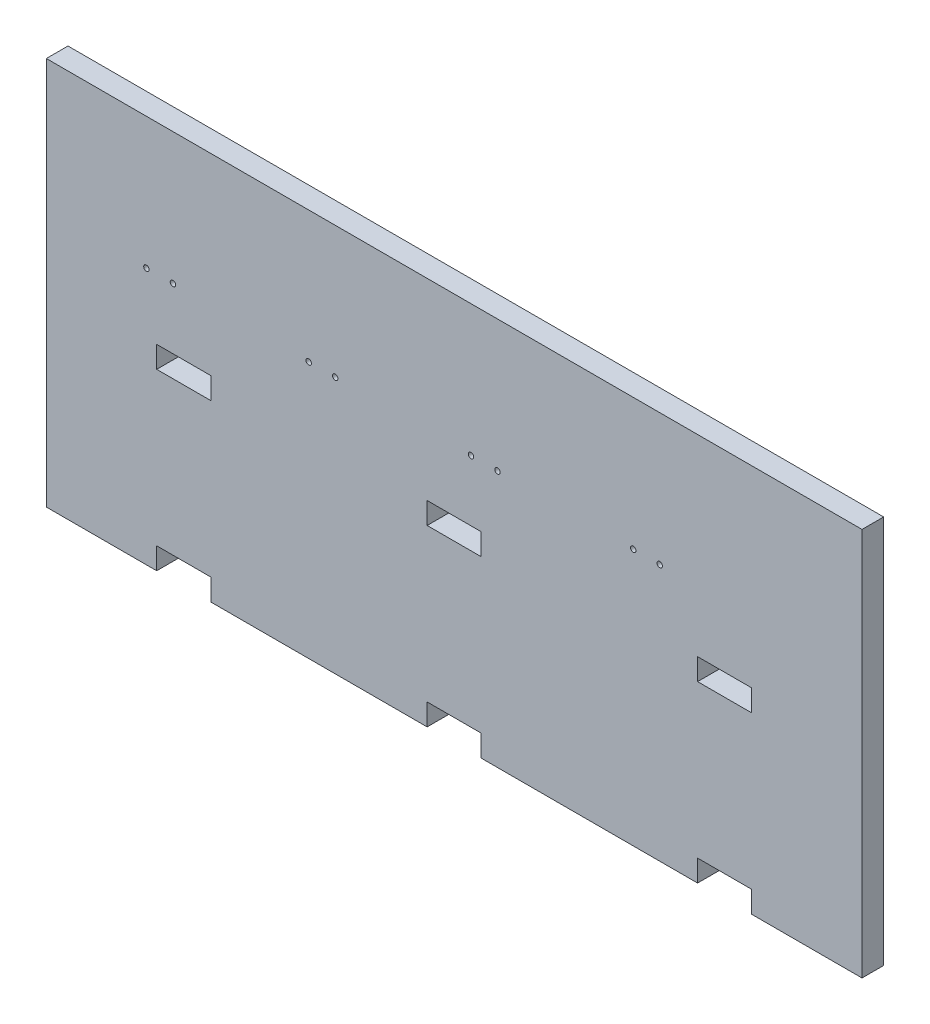
ISO-10303-21;
HEADER;
FILE_DESCRIPTION(('STEP AP214'),'2;1');
FILE_NAME('part.step','',(''),(''),'','','');
FILE_SCHEMA(('AUTOMOTIVE_DESIGN { 1 0 10303 214 1 1 1 1 }'));
ENDSEC;
DATA;
#1=APPLICATION_CONTEXT('core data for automotive mechanical design processes');
#2=APPLICATION_PROTOCOL_DEFINITION('international standard','automotive_design',2000,#1);
#3=PRODUCT_CONTEXT('',#1,'mechanical');
#4=PRODUCT('Part','Part','',(#3));
#5=PRODUCT_RELATED_PRODUCT_CATEGORY('part','',(#4));
#6=PRODUCT_DEFINITION_FORMATION('','',#4);
#7=PRODUCT_DEFINITION_CONTEXT('part definition',#1,'design');
#8=PRODUCT_DEFINITION('design','',#6,#7);
#9=PRODUCT_DEFINITION_SHAPE('','',#8);
#10=(LENGTH_UNIT() NAMED_UNIT(*) SI_UNIT(.MILLI.,.METRE.));
#11=(NAMED_UNIT(*) PLANE_ANGLE_UNIT() SI_UNIT($,.RADIAN.));
#12=(NAMED_UNIT(*) SI_UNIT($,.STERADIAN.) SOLID_ANGLE_UNIT());
#13=UNCERTAINTY_MEASURE_WITH_UNIT(LENGTH_MEASURE(1.E-05),#10,'distance_accuracy_value','');
#14=(GEOMETRIC_REPRESENTATION_CONTEXT(3) GLOBAL_UNCERTAINTY_ASSIGNED_CONTEXT((#13)) GLOBAL_UNIT_ASSIGNED_CONTEXT((#10,
#11,#12)) REPRESENTATION_CONTEXT('',''));
#15=CARTESIAN_POINT('',(0.,0.,0.));
#16=DIRECTION('',(0.,0.,1.));
#17=DIRECTION('',(1.,0.,0.));
#18=AXIS2_PLACEMENT_3D('',#15,#16,#17);
#19=CARTESIAN_POINT('',(-75.4,-35.9109382515555,4.));
#20=DIRECTION('',(0.,1.,0.));
#21=DIRECTION('',(0.,0.,1.));
#22=AXIS2_PLACEMENT_3D('',#19,#20,#21);
#23=PLANE('',#22);
#24=DIRECTION('',(0.,0.,-1.));
#25=VECTOR('',#24,1.);
#26=CARTESIAN_POINT('',(-55.,-35.9109382515555,4.));
#27=LINE('',#26,#25);
#28=CARTESIAN_POINT('',(-55.,-35.9109382515555,4.));
#29=VERTEX_POINT('',#28);
#30=CARTESIAN_POINT('',(-55.,-35.9109382515555,0.));
#31=VERTEX_POINT('',#30);
#32=EDGE_CURVE('E269',#29,#31,#27,.T.);
#33=ORIENTED_EDGE('',*,*,#32,.F.);
#34=DIRECTION('',(1.,0.,0.));
#35=VECTOR('',#34,1.);
#36=CARTESIAN_POINT('',(-75.4,-35.9109382515555,4.));
#37=LINE('',#36,#35);
#38=CARTESIAN_POINT('',(-75.4,-35.9109382515555,4.));
#39=VERTEX_POINT('',#38);
#40=EDGE_CURVE('E451',#39,#29,#37,.T.);
#41=ORIENTED_EDGE('',*,*,#40,.F.);
#42=DIRECTION('',(0.,0.,-1.));
#43=VECTOR('',#42,1.);
#44=CARTESIAN_POINT('',(-75.4,-35.9109382515555,4.));
#45=LINE('',#44,#43);
#46=CARTESIAN_POINT('',(-75.4,-35.9109382515555,0.));
#47=VERTEX_POINT('',#46);
#48=EDGE_CURVE('E473',#39,#47,#45,.T.);
#49=ORIENTED_EDGE('',*,*,#48,.T.);
#50=DIRECTION('',(1.,0.,0.));
#51=VECTOR('',#50,1.);
#52=CARTESIAN_POINT('',(-75.4,-35.9109382515555,0.));
#53=LINE('',#52,#51);
#54=EDGE_CURVE('E444',#47,#31,#53,.T.);
#55=ORIENTED_EDGE('',*,*,#54,.T.);
#56=EDGE_LOOP('',(#33,#41,#49,#55));
#57=FACE_BOUND('',#56,.T.);
#58=ADVANCED_FACE('F38',(#57),#23,.F.);
#59=DIRECTION('',(0.,0.,-1.));
#60=VECTOR('',#59,1.);
#61=CARTESIAN_POINT('',(-45.,-35.9109382515555,4.));
#62=LINE('',#61,#60);
#63=CARTESIAN_POINT('',(-45.,-35.9109382515555,4.));
#64=VERTEX_POINT('',#63);
#65=CARTESIAN_POINT('',(-45.,-35.9109382515555,0.));
#66=VERTEX_POINT('',#65);
#67=EDGE_CURVE('E433',#64,#66,#62,.T.);
#68=ORIENTED_EDGE('',*,*,#67,.T.);
#69=CARTESIAN_POINT('',(-4.99999999999998,-35.9109382515555,0.));
#70=VERTEX_POINT('',#69);
#71=EDGE_CURVE('E469',#66,#70,#53,.T.);
#72=ORIENTED_EDGE('',*,*,#71,.T.);
#73=DIRECTION('',(0.,0.,-1.));
#74=VECTOR('',#73,1.);
#75=CARTESIAN_POINT('',(-4.99999999999997,-35.9109382515555,4.));
#76=LINE('',#75,#74);
#77=CARTESIAN_POINT('',(-4.99999999999997,-35.9109382515555,4.));
#78=VERTEX_POINT('',#77);
#79=EDGE_CURVE('E406',#78,#70,#76,.T.);
#80=ORIENTED_EDGE('',*,*,#79,.F.);
#81=EDGE_CURVE('E456',#64,#78,#37,.T.);
#82=ORIENTED_EDGE('',*,*,#81,.F.);
#83=EDGE_LOOP('',(#68,#72,#80,#82));
#84=FACE_BOUND('',#83,.T.);
#85=ADVANCED_FACE('F606',(#84),#23,.F.);
#86=DIRECTION('',(0.,0.,-1.));
#87=VECTOR('',#86,1.);
#88=CARTESIAN_POINT('',(5.00000000000003,-35.9109382515555,4.));
#89=LINE('',#88,#87);
#90=CARTESIAN_POINT('',(5.00000000000003,-35.9109382515555,4.));
#91=VERTEX_POINT('',#90);
#92=CARTESIAN_POINT('',(5.00000000000003,-35.9109382515555,0.));
#93=VERTEX_POINT('',#92);
#94=EDGE_CURVE('E402',#91,#93,#89,.T.);
#95=ORIENTED_EDGE('',*,*,#94,.T.);
#96=CARTESIAN_POINT('',(45.,-35.9109382515555,0.));
#97=VERTEX_POINT('',#96);
#98=EDGE_CURVE('E627',#93,#97,#53,.T.);
#99=ORIENTED_EDGE('',*,*,#98,.T.);
#100=DIRECTION('',(0.,0.,-1.));
#101=VECTOR('',#100,1.);
#102=CARTESIAN_POINT('',(45.,-35.9109382515555,4.));
#103=LINE('',#102,#101);
#104=CARTESIAN_POINT('',(45.,-35.9109382515555,4.));
#105=VERTEX_POINT('',#104);
#106=EDGE_CURVE('E375',#105,#97,#103,.T.);
#107=ORIENTED_EDGE('',*,*,#106,.F.);
#108=EDGE_CURVE('E591',#91,#105,#37,.T.);
#109=ORIENTED_EDGE('',*,*,#108,.F.);
#110=EDGE_LOOP('',(#95,#99,#107,#109));
#111=FACE_BOUND('',#110,.T.);
#112=ADVANCED_FACE('F629',(#111),#23,.F.);
#113=DIRECTION('',(0.,0.,-1.));
#114=VECTOR('',#113,1.);
#115=CARTESIAN_POINT('',(55.,-35.9109382515555,4.));
#116=LINE('',#115,#114);
#117=CARTESIAN_POINT('',(55.,-35.9109382515555,4.));
#118=VERTEX_POINT('',#117);
#119=CARTESIAN_POINT('',(55.,-35.9109382515555,0.));
#120=VERTEX_POINT('',#119);
#121=EDGE_CURVE('E371',#118,#120,#116,.T.);
#122=ORIENTED_EDGE('',*,*,#121,.T.);
#123=CARTESIAN_POINT('',(75.4,-35.9109382515555,0.));
#124=VERTEX_POINT('',#123);
#125=EDGE_CURVE('E465',#120,#124,#53,.T.);
#126=ORIENTED_EDGE('',*,*,#125,.T.);
#127=DIRECTION('',(0.,0.,-1.));
#128=VECTOR('',#127,1.);
#129=CARTESIAN_POINT('',(75.4,-35.9109382515555,4.));
#130=LINE('',#129,#128);
#131=CARTESIAN_POINT('',(75.4,-35.9109382515555,4.));
#132=VERTEX_POINT('',#131);
#133=EDGE_CURVE('E455',#132,#124,#130,.T.);
#134=ORIENTED_EDGE('',*,*,#133,.F.);
#135=EDGE_CURVE('E450',#118,#132,#37,.T.);
#136=ORIENTED_EDGE('',*,*,#135,.F.);
#137=EDGE_LOOP('',(#122,#126,#134,#136));
#138=FACE_BOUND('',#137,.T.);
#139=ADVANCED_FACE('F586',(#138),#23,.F.);
#140=CARTESIAN_POINT('',(0.,0.,4.));
#141=DIRECTION('',(0.,0.,1.));
#142=DIRECTION('',(1.,0.,0.));
#143=AXIS2_PLACEMENT_3D('',#140,#141,#142);
#144=PLANE('',#143);
#145=CARTESIAN_POINT('',(38.,11.5911987972563,4.));
#146=DIRECTION('',(0.,0.,1.));
#147=DIRECTION('',(1.,0.,0.));
#148=AXIS2_PLACEMENT_3D('',#145,#146,#147);
#149=CIRCLE('',#148,0.5);
#150=CARTESIAN_POINT('',(38.5,11.5911987972563,4.));
#151=VERTEX_POINT('',#150);
#152=EDGE_CURVE('E361',#151,#151,#149,.F.);
#153=ORIENTED_EDGE('',*,*,#152,.T.);
#154=EDGE_LOOP('',(#153));
#155=FACE_BOUND('',#154,.T.);
#156=CARTESIAN_POINT('',(33.1,11.5911987972563,4.));
#157=DIRECTION('',(0.,0.,1.));
#158=DIRECTION('',(1.,0.,0.));
#159=AXIS2_PLACEMENT_3D('',#156,#157,#158);
#160=CIRCLE('',#159,0.5);
#161=CARTESIAN_POINT('',(33.6,11.5911987972563,4.));
#162=VERTEX_POINT('',#161);
#163=EDGE_CURVE('E527',#162,#162,#160,.F.);
#164=ORIENTED_EDGE('',*,*,#163,.T.);
#165=EDGE_LOOP('',(#164));
#166=FACE_BOUND('',#165,.T.);
#167=CARTESIAN_POINT('',(8.00000000000001,11.5911987972563,4.));
#168=DIRECTION('',(0.,0.,1.));
#169=DIRECTION('',(1.,0.,0.));
#170=AXIS2_PLACEMENT_3D('',#167,#168,#169);
#171=CIRCLE('',#170,0.5);
#172=CARTESIAN_POINT('',(8.50000000000001,11.5911987972563,4.));
#173=VERTEX_POINT('',#172);
#174=EDGE_CURVE('E523',#173,#173,#171,.F.);
#175=ORIENTED_EDGE('',*,*,#174,.T.);
#176=EDGE_LOOP('',(#175));
#177=FACE_BOUND('',#176,.T.);
#178=CARTESIAN_POINT('',(3.10000000000005,11.5911987972563,4.));
#179=DIRECTION('',(0.,0.,1.));
#180=DIRECTION('',(1.,0.,0.));
#181=AXIS2_PLACEMENT_3D('',#178,#179,#180);
#182=CIRCLE('',#181,0.5);
#183=CARTESIAN_POINT('',(3.60000000000005,11.5911987972563,4.));
#184=VERTEX_POINT('',#183);
#185=EDGE_CURVE('E519',#184,#184,#182,.F.);
#186=ORIENTED_EDGE('',*,*,#185,.T.);
#187=EDGE_LOOP('',(#186));
#188=FACE_BOUND('',#187,.T.);
#189=CARTESIAN_POINT('',(-22.,11.5911987972563,4.));
#190=DIRECTION('',(0.,0.,1.));
#191=DIRECTION('',(1.,0.,0.));
#192=AXIS2_PLACEMENT_3D('',#189,#190,#191);
#193=CIRCLE('',#192,0.5);
#194=CARTESIAN_POINT('',(-21.5,11.5911987972563,4.));
#195=VERTEX_POINT('',#194);
#196=EDGE_CURVE('E514',#195,#195,#193,.F.);
#197=ORIENTED_EDGE('',*,*,#196,.T.);
#198=EDGE_LOOP('',(#197));
#199=FACE_BOUND('',#198,.T.);
#200=CARTESIAN_POINT('',(-26.8999999999999,11.5911987972563,4.));
#201=DIRECTION('',(0.,0.,1.));
#202=DIRECTION('',(1.,0.,0.));
#203=AXIS2_PLACEMENT_3D('',#200,#201,#202);
#204=CIRCLE('',#203,0.5);
#205=CARTESIAN_POINT('',(-26.3999999999999,11.5911987972563,4.));
#206=VERTEX_POINT('',#205);
#207=EDGE_CURVE('E509',#206,#206,#204,.F.);
#208=ORIENTED_EDGE('',*,*,#207,.T.);
#209=EDGE_LOOP('',(#208));
#210=FACE_BOUND('',#209,.T.);
#211=CARTESIAN_POINT('',(-52.,11.5911987972563,4.));
#212=DIRECTION('',(0.,0.,1.));
#213=DIRECTION('',(1.,0.,0.));
#214=AXIS2_PLACEMENT_3D('',#211,#212,#213);
#215=CIRCLE('',#214,0.5);
#216=CARTESIAN_POINT('',(-51.5,11.5911987972563,4.));
#217=VERTEX_POINT('',#216);
#218=EDGE_CURVE('E504',#217,#217,#215,.F.);
#219=ORIENTED_EDGE('',*,*,#218,.T.);
#220=EDGE_LOOP('',(#219));
#221=FACE_BOUND('',#220,.T.);
#222=CARTESIAN_POINT('',(-56.8999999999999,11.5911987972563,4.));
#223=DIRECTION('',(0.,0.,1.));
#224=DIRECTION('',(1.,0.,0.));
#225=AXIS2_PLACEMENT_3D('',#222,#223,#224);
#226=CIRCLE('',#225,0.5);
#227=CARTESIAN_POINT('',(-56.3999999999999,11.5911987972563,4.));
#228=VERTEX_POINT('',#227);
#229=EDGE_CURVE('E499',#228,#228,#226,.F.);
#230=ORIENTED_EDGE('',*,*,#229,.T.);
#231=EDGE_LOOP('',(#230));
#232=FACE_BOUND('',#231,.T.);
#233=ORIENTED_EDGE('',*,*,#40,.T.);
#234=DIRECTION('',(0.,-1.,0.));
#235=VECTOR('',#234,1.);
#236=CARTESIAN_POINT('',(-55.,-31.9109382515555,4.));
#237=LINE('',#236,#235);
#238=CARTESIAN_POINT('',(-55.,-31.9109382515555,4.));
#239=VERTEX_POINT('',#238);
#240=EDGE_CURVE('E410',#239,#29,#237,.T.);
#241=ORIENTED_EDGE('',*,*,#240,.F.);
#242=DIRECTION('',(-1.,0.,0.));
#243=VECTOR('',#242,1.);
#244=CARTESIAN_POINT('',(-55.,-31.9109382515555,4.));
#245=LINE('',#244,#243);
#246=CARTESIAN_POINT('',(-45.,-31.9109382515555,4.));
#247=VERTEX_POINT('',#246);
#248=EDGE_CURVE('E417',#247,#239,#245,.T.);
#249=ORIENTED_EDGE('',*,*,#248,.F.);
#250=DIRECTION('',(0.,1.,0.));
#251=VECTOR('',#250,1.);
#252=CARTESIAN_POINT('',(-45.,-31.9109382515555,4.));
#253=LINE('',#252,#251);
#254=EDGE_CURVE('E413',#64,#247,#253,.T.);
#255=ORIENTED_EDGE('',*,*,#254,.F.);
#256=ORIENTED_EDGE('',*,*,#81,.T.);
#257=DIRECTION('',(0.,-1.,0.));
#258=VECTOR('',#257,1.);
#259=CARTESIAN_POINT('',(-4.99999999999997,-31.9109382515555,4.));
#260=LINE('',#259,#258);
#261=CARTESIAN_POINT('',(-4.99999999999997,-31.9109382515555,4.));
#262=VERTEX_POINT('',#261);
#263=EDGE_CURVE('E379',#262,#78,#260,.T.);
#264=ORIENTED_EDGE('',*,*,#263,.F.);
#265=DIRECTION('',(-1.,0.,0.));
#266=VECTOR('',#265,1.);
#267=CARTESIAN_POINT('',(-4.99999999999997,-31.9109382515555,4.));
#268=LINE('',#267,#266);
#269=CARTESIAN_POINT('',(5.00000000000003,-31.9109382515555,4.));
#270=VERTEX_POINT('',#269);
#271=EDGE_CURVE('E386',#270,#262,#268,.T.);
#272=ORIENTED_EDGE('',*,*,#271,.F.);
#273=DIRECTION('',(0.,1.,0.));
#274=VECTOR('',#273,1.);
#275=CARTESIAN_POINT('',(5.00000000000003,-31.9109382515555,4.));
#276=LINE('',#275,#274);
#277=EDGE_CURVE('E382',#91,#270,#276,.T.);
#278=ORIENTED_EDGE('',*,*,#277,.F.);
#279=ORIENTED_EDGE('',*,*,#108,.T.);
#280=DIRECTION('',(0.,-1.,0.));
#281=VECTOR('',#280,1.);
#282=CARTESIAN_POINT('',(45.,-31.9109382515555,4.));
#283=LINE('',#282,#281);
#284=CARTESIAN_POINT('',(45.,-31.9109382515555,4.));
#285=VERTEX_POINT('',#284);
#286=EDGE_CURVE('E346',#285,#105,#283,.T.);
#287=ORIENTED_EDGE('',*,*,#286,.F.);
#288=DIRECTION('',(-1.,0.,0.));
#289=VECTOR('',#288,1.);
#290=CARTESIAN_POINT('',(45.,-31.9109382515555,4.));
#291=LINE('',#290,#289);
#292=CARTESIAN_POINT('',(55.,-31.9109382515555,4.));
#293=VERTEX_POINT('',#292);
#294=EDGE_CURVE('E353',#293,#285,#291,.T.);
#295=ORIENTED_EDGE('',*,*,#294,.F.);
#296=DIRECTION('',(0.,1.,0.));
#297=VECTOR('',#296,1.);
#298=CARTESIAN_POINT('',(55.,-31.9109382515555,4.));
#299=LINE('',#298,#297);
#300=EDGE_CURVE('E349',#118,#293,#299,.T.);
#301=ORIENTED_EDGE('',*,*,#300,.F.);
#302=ORIENTED_EDGE('',*,*,#135,.T.);
#303=DIRECTION('',(0.,1.,0.));
#304=VECTOR('',#303,1.);
#305=CARTESIAN_POINT('',(75.4,35.9109382515555,4.));
#306=LINE('',#305,#304);
#307=CARTESIAN_POINT('',(75.4,35.9109382515555,4.));
#308=VERTEX_POINT('',#307);
#309=EDGE_CURVE('E439',#132,#308,#306,.T.);
#310=ORIENTED_EDGE('',*,*,#309,.T.);
#311=DIRECTION('',(-1.,0.,0.));
#312=VECTOR('',#311,1.);
#313=CARTESIAN_POINT('',(-75.4,35.9109382515555,4.));
#314=LINE('',#313,#312);
#315=CARTESIAN_POINT('',(-75.4,35.9109382515555,4.));
#316=VERTEX_POINT('',#315);
#317=EDGE_CURVE('E443',#308,#316,#314,.T.);
#318=ORIENTED_EDGE('',*,*,#317,.T.);
#319=DIRECTION('',(0.,-1.,0.));
#320=VECTOR('',#319,1.);
#321=CARTESIAN_POINT('',(-75.4,35.9109382515555,4.));
#322=LINE('',#321,#320);
#323=EDGE_CURVE('E447',#316,#39,#322,.T.);
#324=ORIENTED_EDGE('',*,*,#323,.T.);
#325=EDGE_LOOP('',(#233,#241,#249,#255,#256,#264,#272,#278,#279,#287,#295,#301,#302,#310,#318,#324));
#326=FACE_BOUND('',#325,.T.);
#327=DIRECTION('',(1.,0.,0.));
#328=VECTOR('',#327,1.);
#329=CARTESIAN_POINT('',(45.,-3.65880120274368,3.99999999999996));
#330=LINE('',#329,#328);
#331=CARTESIAN_POINT('',(45.,-3.65880120274368,3.99999999999996));
#332=VERTEX_POINT('',#331);
#333=CARTESIAN_POINT('',(55.,-3.65880120274368,4.));
#334=VERTEX_POINT('',#333);
#335=EDGE_CURVE('E240',#332,#334,#330,.T.);
#336=ORIENTED_EDGE('',*,*,#335,.F.);
#337=DIRECTION('',(0.,-1.,0.));
#338=VECTOR('',#337,1.);
#339=CARTESIAN_POINT('',(45.,0.341198797256317,3.99999999999996));
#340=LINE('',#339,#338);
#341=CARTESIAN_POINT('',(45.,0.341198797256317,3.99999999999996));
#342=VERTEX_POINT('',#341);
#343=EDGE_CURVE('E229',#342,#332,#340,.T.);
#344=ORIENTED_EDGE('',*,*,#343,.F.);
#345=DIRECTION('',(-1.,0.,0.));
#346=VECTOR('',#345,1.);
#347=CARTESIAN_POINT('',(45.,0.341198797256317,3.99999999999996));
#348=LINE('',#347,#346);
#349=CARTESIAN_POINT('',(55.,0.34119879725632,3.99999999999996));
#350=VERTEX_POINT('',#349);
#351=EDGE_CURVE('E260',#350,#342,#348,.T.);
#352=ORIENTED_EDGE('',*,*,#351,.F.);
#353=DIRECTION('',(0.,1.,0.));
#354=VECTOR('',#353,1.);
#355=CARTESIAN_POINT('',(55.,0.34119879725632,3.99999999999996));
#356=LINE('',#355,#354);
#357=EDGE_CURVE('E256',#334,#350,#356,.T.);
#358=ORIENTED_EDGE('',*,*,#357,.F.);
#359=EDGE_LOOP('',(#336,#344,#352,#358));
#360=FACE_BOUND('',#359,.T.);
#361=DIRECTION('',(1.,0.,0.));
#362=VECTOR('',#361,1.);
#363=CARTESIAN_POINT('',(-4.99999999999999,-3.6588012027437,3.99999999999996));
#364=LINE('',#363,#362);
#365=CARTESIAN_POINT('',(-4.99999999999999,-3.6588012027437,3.99999999999996));
#366=VERTEX_POINT('',#365);
#367=CARTESIAN_POINT('',(5.00000000000001,-3.6588012027437,4.));
#368=VERTEX_POINT('',#367);
#369=EDGE_CURVE('E283',#366,#368,#364,.T.);
#370=ORIENTED_EDGE('',*,*,#369,.F.);
#371=DIRECTION('',(0.,-1.,0.));
#372=VECTOR('',#371,1.);
#373=CARTESIAN_POINT('',(-4.99999999999999,0.3411987972563,3.99999999999996));
#374=LINE('',#373,#372);
#375=CARTESIAN_POINT('',(-4.99999999999999,0.3411987972563,3.99999999999996));
#376=VERTEX_POINT('',#375);
#377=EDGE_CURVE('E280',#376,#366,#374,.T.);
#378=ORIENTED_EDGE('',*,*,#377,.F.);
#379=DIRECTION('',(-1.,0.,0.));
#380=VECTOR('',#379,1.);
#381=CARTESIAN_POINT('',(-4.99999999999999,0.3411987972563,3.99999999999996));
#382=LINE('',#381,#380);
#383=CARTESIAN_POINT('',(5.00000000000001,0.341198797256302,3.99999999999996));
#384=VERTEX_POINT('',#383);
#385=EDGE_CURVE('E290',#384,#376,#382,.T.);
#386=ORIENTED_EDGE('',*,*,#385,.F.);
#387=DIRECTION('',(0.,1.,0.));
#388=VECTOR('',#387,1.);
#389=CARTESIAN_POINT('',(5.00000000000001,0.341198797256302,3.99999999999996));
#390=LINE('',#389,#388);
#391=EDGE_CURVE('E287',#368,#384,#390,.T.);
#392=ORIENTED_EDGE('',*,*,#391,.F.);
#393=EDGE_LOOP('',(#370,#378,#386,#392));
#394=FACE_BOUND('',#393,.T.);
#395=DIRECTION('',(1.,0.,0.));
#396=VECTOR('',#395,1.);
#397=CARTESIAN_POINT('',(-55.,-3.6588012027437,3.99999999999996));
#398=LINE('',#397,#396);
#399=CARTESIAN_POINT('',(-55.,-3.6588012027437,3.99999999999996));
#400=VERTEX_POINT('',#399);
#401=CARTESIAN_POINT('',(-45.,-3.6588012027437,4.));
#402=VERTEX_POINT('',#401);
#403=EDGE_CURVE('E316',#400,#402,#398,.T.);
#404=ORIENTED_EDGE('',*,*,#403,.F.);
#405=DIRECTION('',(0.,-1.,0.));
#406=VECTOR('',#405,1.);
#407=CARTESIAN_POINT('',(-55.,0.3411987972563,3.99999999999996));
#408=LINE('',#407,#406);
#409=CARTESIAN_POINT('',(-55.,0.3411987972563,3.99999999999996));
#410=VERTEX_POINT('',#409);
#411=EDGE_CURVE('E313',#410,#400,#408,.T.);
#412=ORIENTED_EDGE('',*,*,#411,.F.);
#413=DIRECTION('',(-1.,0.,0.));
#414=VECTOR('',#413,1.);
#415=CARTESIAN_POINT('',(-55.,0.3411987972563,3.99999999999996));
#416=LINE('',#415,#414);
#417=CARTESIAN_POINT('',(-45.,0.3411987972563,3.99999999999996));
#418=VERTEX_POINT('',#417);
#419=EDGE_CURVE('E323',#418,#410,#416,.T.);
#420=ORIENTED_EDGE('',*,*,#419,.F.);
#421=DIRECTION('',(0.,1.,0.));
#422=VECTOR('',#421,1.);
#423=CARTESIAN_POINT('',(-45.,0.3411987972563,3.99999999999996));
#424=LINE('',#423,#422);
#425=EDGE_CURVE('E320',#402,#418,#424,.T.);
#426=ORIENTED_EDGE('',*,*,#425,.F.);
#427=EDGE_LOOP('',(#404,#412,#420,#426));
#428=FACE_BOUND('',#427,.T.);
#429=ADVANCED_FACE('F254',(#155,#166,#177,#188,#199,#210,#221,#232,#326,#360,#394,#428),#144,.T.);
#430=CARTESIAN_POINT('',(75.4,35.9109382515555,4.));
#431=DIRECTION('',(-1.,0.,0.));
#432=DIRECTION('',(0.,0.,1.));
#433=AXIS2_PLACEMENT_3D('',#430,#431,#432);
#434=PLANE('',#433);
#435=DIRECTION('',(0.,1.,0.));
#436=VECTOR('',#435,1.);
#437=CARTESIAN_POINT('',(75.4,35.9109382515555,0.));
#438=LINE('',#437,#436);
#439=CARTESIAN_POINT('',(75.4,35.9109382515555,0.));
#440=VERTEX_POINT('',#439);
#441=EDGE_CURVE('E345',#124,#440,#438,.T.);
#442=ORIENTED_EDGE('',*,*,#441,.T.);
#443=DIRECTION('',(0.,0.,-1.));
#444=VECTOR('',#443,1.);
#445=CARTESIAN_POINT('',(75.4,35.9109382515555,4.));
#446=LINE('',#445,#444);
#447=EDGE_CURVE('E481',#308,#440,#446,.T.);
#448=ORIENTED_EDGE('',*,*,#447,.F.);
#449=ORIENTED_EDGE('',*,*,#309,.F.);
#450=ORIENTED_EDGE('',*,*,#133,.T.);
#451=EDGE_LOOP('',(#442,#448,#449,#450));
#452=FACE_BOUND('',#451,.T.);
#453=ADVANCED_FACE('F40',(#452),#434,.F.);
#454=CARTESIAN_POINT('',(-75.4,35.9109382515555,4.));
#455=DIRECTION('',(0.,-1.,0.));
#456=DIRECTION('',(0.,0.,-1.));
#457=AXIS2_PLACEMENT_3D('',#454,#455,#456);
#458=PLANE('',#457);
#459=DIRECTION('',(-1.,0.,0.));
#460=VECTOR('',#459,1.);
#461=CARTESIAN_POINT('',(-75.4,35.9109382515555,0.));
#462=LINE('',#461,#460);
#463=CARTESIAN_POINT('',(-75.4,35.9109382515555,0.));
#464=VERTEX_POINT('',#463);
#465=EDGE_CURVE('E459',#440,#464,#462,.T.);
#466=ORIENTED_EDGE('',*,*,#465,.T.);
#467=DIRECTION('',(0.,0.,-1.));
#468=VECTOR('',#467,1.);
#469=CARTESIAN_POINT('',(-75.4,35.9109382515555,4.));
#470=LINE('',#469,#468);
#471=EDGE_CURVE('E477',#316,#464,#470,.T.);
#472=ORIENTED_EDGE('',*,*,#471,.F.);
#473=ORIENTED_EDGE('',*,*,#317,.F.);
#474=ORIENTED_EDGE('',*,*,#447,.T.);
#475=EDGE_LOOP('',(#466,#472,#473,#474));
#476=FACE_BOUND('',#475,.T.);
#477=ADVANCED_FACE('F678',(#476),#458,.F.);
#478=CARTESIAN_POINT('',(-75.4,35.9109382515555,4.));
#479=DIRECTION('',(1.,0.,0.));
#480=DIRECTION('',(0.,0.,-1.));
#481=AXIS2_PLACEMENT_3D('',#478,#479,#480);
#482=PLANE('',#481);
#483=DIRECTION('',(0.,-1.,0.));
#484=VECTOR('',#483,1.);
#485=CARTESIAN_POINT('',(-75.4,35.9109382515555,0.));
#486=LINE('',#485,#484);
#487=EDGE_CURVE('E462',#464,#47,#486,.T.);
#488=ORIENTED_EDGE('',*,*,#487,.T.);
#489=ORIENTED_EDGE('',*,*,#48,.F.);
#490=ORIENTED_EDGE('',*,*,#323,.F.);
#491=ORIENTED_EDGE('',*,*,#471,.T.);
#492=EDGE_LOOP('',(#488,#489,#490,#491));
#493=FACE_BOUND('',#492,.T.);
#494=ADVANCED_FACE('F554',(#493),#482,.F.);
#495=CARTESIAN_POINT('',(0.,0.,0.));
#496=DIRECTION('',(0.,0.,1.));
#497=DIRECTION('',(1.,0.,0.));
#498=AXIS2_PLACEMENT_3D('',#495,#496,#497);
#499=PLANE('',#498);
#500=CARTESIAN_POINT('',(38.,11.5911987972563,0.));
#501=DIRECTION('',(0.,0.,1.));
#502=DIRECTION('',(1.,0.,0.));
#503=AXIS2_PLACEMENT_3D('',#500,#501,#502);
#504=CIRCLE('',#503,0.5);
#505=CARTESIAN_POINT('',(38.5,11.5911987972563,0.));
#506=VERTEX_POINT('',#505);
#507=EDGE_CURVE('E42',#506,#506,#504,.F.);
#508=ORIENTED_EDGE('',*,*,#507,.F.);
#509=EDGE_LOOP('',(#508));
#510=FACE_BOUND('',#509,.T.);
#511=CARTESIAN_POINT('',(33.1,11.5911987972563,0.));
#512=DIRECTION('',(0.,0.,1.));
#513=DIRECTION('',(1.,0.,0.));
#514=AXIS2_PLACEMENT_3D('',#511,#512,#513);
#515=CIRCLE('',#514,0.5);
#516=CARTESIAN_POINT('',(33.6,11.5911987972563,0.));
#517=VERTEX_POINT('',#516);
#518=EDGE_CURVE('E524',#517,#517,#515,.F.);
#519=ORIENTED_EDGE('',*,*,#518,.F.);
#520=EDGE_LOOP('',(#519));
#521=FACE_BOUND('',#520,.T.);
#522=CARTESIAN_POINT('',(8.00000000000001,11.5911987972563,0.));
#523=DIRECTION('',(0.,0.,1.));
#524=DIRECTION('',(1.,0.,0.));
#525=AXIS2_PLACEMENT_3D('',#522,#523,#524);
#526=CIRCLE('',#525,0.5);
#527=CARTESIAN_POINT('',(8.50000000000001,11.5911987972563,0.));
#528=VERTEX_POINT('',#527);
#529=EDGE_CURVE('E520',#528,#528,#526,.F.);
#530=ORIENTED_EDGE('',*,*,#529,.F.);
#531=EDGE_LOOP('',(#530));
#532=FACE_BOUND('',#531,.T.);
#533=CARTESIAN_POINT('',(3.10000000000005,11.5911987972563,0.));
#534=DIRECTION('',(0.,0.,1.));
#535=DIRECTION('',(1.,0.,0.));
#536=AXIS2_PLACEMENT_3D('',#533,#534,#535);
#537=CIRCLE('',#536,0.5);
#538=CARTESIAN_POINT('',(3.60000000000005,11.5911987972563,0.));
#539=VERTEX_POINT('',#538);
#540=EDGE_CURVE('E515',#539,#539,#537,.F.);
#541=ORIENTED_EDGE('',*,*,#540,.F.);
#542=EDGE_LOOP('',(#541));
#543=FACE_BOUND('',#542,.T.);
#544=CARTESIAN_POINT('',(-22.,11.5911987972563,0.));
#545=DIRECTION('',(0.,0.,1.));
#546=DIRECTION('',(1.,0.,0.));
#547=AXIS2_PLACEMENT_3D('',#544,#545,#546);
#548=CIRCLE('',#547,0.5);
#549=CARTESIAN_POINT('',(-21.5,11.5911987972563,0.));
#550=VERTEX_POINT('',#549);
#551=EDGE_CURVE('E510',#550,#550,#548,.F.);
#552=ORIENTED_EDGE('',*,*,#551,.F.);
#553=EDGE_LOOP('',(#552));
#554=FACE_BOUND('',#553,.T.);
#555=CARTESIAN_POINT('',(-26.8999999999999,11.5911987972563,0.));
#556=DIRECTION('',(0.,0.,1.));
#557=DIRECTION('',(1.,0.,0.));
#558=AXIS2_PLACEMENT_3D('',#555,#556,#557);
#559=CIRCLE('',#558,0.5);
#560=CARTESIAN_POINT('',(-26.3999999999999,11.5911987972563,0.));
#561=VERTEX_POINT('',#560);
#562=EDGE_CURVE('E505',#561,#561,#559,.F.);
#563=ORIENTED_EDGE('',*,*,#562,.F.);
#564=EDGE_LOOP('',(#563));
#565=FACE_BOUND('',#564,.T.);
#566=CARTESIAN_POINT('',(-52.,11.5911987972563,0.));
#567=DIRECTION('',(0.,0.,1.));
#568=DIRECTION('',(1.,0.,0.));
#569=AXIS2_PLACEMENT_3D('',#566,#567,#568);
#570=CIRCLE('',#569,0.5);
#571=CARTESIAN_POINT('',(-51.5,11.5911987972563,0.));
#572=VERTEX_POINT('',#571);
#573=EDGE_CURVE('E500',#572,#572,#570,.F.);
#574=ORIENTED_EDGE('',*,*,#573,.F.);
#575=EDGE_LOOP('',(#574));
#576=FACE_BOUND('',#575,.T.);
#577=CARTESIAN_POINT('',(-56.8999999999999,11.5911987972563,0.));
#578=DIRECTION('',(0.,0.,1.));
#579=DIRECTION('',(1.,0.,0.));
#580=AXIS2_PLACEMENT_3D('',#577,#578,#579);
#581=CIRCLE('',#580,0.5);
#582=CARTESIAN_POINT('',(-56.3999999999999,11.5911987972563,0.));
#583=VERTEX_POINT('',#582);
#584=EDGE_CURVE('E495',#583,#583,#581,.F.);
#585=ORIENTED_EDGE('',*,*,#584,.F.);
#586=EDGE_LOOP('',(#585));
#587=FACE_BOUND('',#586,.T.);
#588=DIRECTION('',(1.,0.,0.));
#589=VECTOR('',#588,1.);
#590=CARTESIAN_POINT('',(0.,0.3411987972563,0.));
#591=LINE('',#590,#589);
#592=CARTESIAN_POINT('',(-55.,0.3411987972563,0.));
#593=VERTEX_POINT('',#592);
#594=CARTESIAN_POINT('',(-45.,0.3411987972563,0.));
#595=VERTEX_POINT('',#594);
#596=EDGE_CURVE('E11',#593,#595,#591,.T.);
#597=ORIENTED_EDGE('',*,*,#596,.F.);
#598=DIRECTION('',(0.,-1.,0.));
#599=VECTOR('',#598,1.);
#600=CARTESIAN_POINT('',(-55.,0.3411987972563,0.));
#601=LINE('',#600,#599);
#602=CARTESIAN_POINT('',(-55.,-3.6588012027437,0.));
#603=VERTEX_POINT('',#602);
#604=EDGE_CURVE('E312',#593,#603,#601,.T.);
#605=ORIENTED_EDGE('',*,*,#604,.T.);
#606=DIRECTION('',(1.,0.,0.));
#607=VECTOR('',#606,1.);
#608=CARTESIAN_POINT('',(0.,-3.6588012027437,0.));
#609=LINE('',#608,#607);
#610=CARTESIAN_POINT('',(-45.,-3.6588012027437,0.));
#611=VERTEX_POINT('',#610);
#612=EDGE_CURVE('E48',#603,#611,#609,.T.);
#613=ORIENTED_EDGE('',*,*,#612,.T.);
#614=DIRECTION('',(0.,1.,0.));
#615=VECTOR('',#614,1.);
#616=CARTESIAN_POINT('',(-45.,0.3411987972563,0.));
#617=LINE('',#616,#615);
#618=EDGE_CURVE('E317',#611,#595,#617,.T.);
#619=ORIENTED_EDGE('',*,*,#618,.T.);
#620=EDGE_LOOP('',(#597,#605,#613,#619));
#621=FACE_BOUND('',#620,.T.);
#622=CARTESIAN_POINT('',(-5.,0.3411987972563,0.));
#623=VERTEX_POINT('',#622);
#624=CARTESIAN_POINT('',(5.00000000000001,0.341198797256302,0.));
#625=VERTEX_POINT('',#624);
#626=EDGE_CURVE('E50',#623,#625,#591,.T.);
#627=ORIENTED_EDGE('',*,*,#626,.F.);
#628=DIRECTION('',(0.,-1.,0.));
#629=VECTOR('',#628,1.);
#630=CARTESIAN_POINT('',(-4.99999999999999,0.3411987972563,0.));
#631=LINE('',#630,#629);
#632=CARTESIAN_POINT('',(-5.,-3.6588012027437,0.));
#633=VERTEX_POINT('',#632);
#634=EDGE_CURVE('E251',#623,#633,#631,.T.);
#635=ORIENTED_EDGE('',*,*,#634,.T.);
#636=CARTESIAN_POINT('',(5.00000000000001,-3.6588012027437,0.));
#637=VERTEX_POINT('',#636);
#638=EDGE_CURVE('E493',#633,#637,#609,.T.);
#639=ORIENTED_EDGE('',*,*,#638,.T.);
#640=DIRECTION('',(0.,1.,0.));
#641=VECTOR('',#640,1.);
#642=CARTESIAN_POINT('',(5.00000000000001,0.341198797256302,0.));
#643=LINE('',#642,#641);
#644=EDGE_CURVE('E284',#637,#625,#643,.T.);
#645=ORIENTED_EDGE('',*,*,#644,.T.);
#646=EDGE_LOOP('',(#627,#635,#639,#645));
#647=FACE_BOUND('',#646,.T.);
#648=CARTESIAN_POINT('',(45.,0.3411987972563,0.));
#649=VERTEX_POINT('',#648);
#650=CARTESIAN_POINT('',(55.,0.34119879725632,0.));
#651=VERTEX_POINT('',#650);
#652=EDGE_CURVE('E51',#649,#651,#591,.T.);
#653=ORIENTED_EDGE('',*,*,#652,.F.);
#654=DIRECTION('',(0.,-1.,0.));
#655=VECTOR('',#654,1.);
#656=CARTESIAN_POINT('',(45.,0.341198797256317,0.));
#657=LINE('',#656,#655);
#658=CARTESIAN_POINT('',(45.,-3.6588012027437,0.));
#659=VERTEX_POINT('',#658);
#660=EDGE_CURVE('E266',#649,#659,#657,.T.);
#661=ORIENTED_EDGE('',*,*,#660,.T.);
#662=CARTESIAN_POINT('',(55.,-3.65880120274368,0.));
#663=VERTEX_POINT('',#662);
#664=EDGE_CURVE('E249',#659,#663,#609,.T.);
#665=ORIENTED_EDGE('',*,*,#664,.T.);
#666=DIRECTION('',(0.,1.,0.));
#667=VECTOR('',#666,1.);
#668=CARTESIAN_POINT('',(55.,0.34119879725632,0.));
#669=LINE('',#668,#667);
#670=EDGE_CURVE('E241',#663,#651,#669,.T.);
#671=ORIENTED_EDGE('',*,*,#670,.T.);
#672=EDGE_LOOP('',(#653,#661,#665,#671));
#673=FACE_BOUND('',#672,.T.);
#674=DIRECTION('',(0.,1.,0.));
#675=VECTOR('',#674,1.);
#676=CARTESIAN_POINT('',(55.,-31.9109382515555,0.));
#677=LINE('',#676,#675);
#678=CARTESIAN_POINT('',(55.,-31.9109382515555,0.));
#679=VERTEX_POINT('',#678);
#680=EDGE_CURVE('E350',#120,#679,#677,.T.);
#681=ORIENTED_EDGE('',*,*,#680,.T.);
#682=DIRECTION('',(1.,0.,0.));
#683=VECTOR('',#682,1.);
#684=CARTESIAN_POINT('',(0.,-31.9109382515555,0.));
#685=LINE('',#684,#683);
#686=CARTESIAN_POINT('',(45.,-31.9109382515555,0.));
#687=VERTEX_POINT('',#686);
#688=EDGE_CURVE('E485',#687,#679,#685,.T.);
#689=ORIENTED_EDGE('',*,*,#688,.F.);
#690=DIRECTION('',(0.,-1.,0.));
#691=VECTOR('',#690,1.);
#692=CARTESIAN_POINT('',(45.,-31.9109382515555,0.));
#693=LINE('',#692,#691);
#694=EDGE_CURVE('E357',#687,#97,#693,.T.);
#695=ORIENTED_EDGE('',*,*,#694,.T.);
#696=ORIENTED_EDGE('',*,*,#98,.F.);
#697=DIRECTION('',(0.,1.,0.));
#698=VECTOR('',#697,1.);
#699=CARTESIAN_POINT('',(5.00000000000003,-31.9109382515555,0.));
#700=LINE('',#699,#698);
#701=CARTESIAN_POINT('',(5.00000000000003,-31.9109382515555,0.));
#702=VERTEX_POINT('',#701);
#703=EDGE_CURVE('E383',#93,#702,#700,.T.);
#704=ORIENTED_EDGE('',*,*,#703,.T.);
#705=CARTESIAN_POINT('',(-4.99999999999998,-31.9109382515555,0.));
#706=VERTEX_POINT('',#705);
#707=EDGE_CURVE('E490',#706,#702,#685,.T.);
#708=ORIENTED_EDGE('',*,*,#707,.F.);
#709=DIRECTION('',(0.,-1.,0.));
#710=VECTOR('',#709,1.);
#711=CARTESIAN_POINT('',(-4.99999999999997,-31.9109382515555,0.));
#712=LINE('',#711,#710);
#713=EDGE_CURVE('E378',#706,#70,#712,.T.);
#714=ORIENTED_EDGE('',*,*,#713,.T.);
#715=ORIENTED_EDGE('',*,*,#71,.F.);
#716=DIRECTION('',(0.,1.,0.));
#717=VECTOR('',#716,1.);
#718=CARTESIAN_POINT('',(-45.,-31.9109382515555,0.));
#719=LINE('',#718,#717);
#720=CARTESIAN_POINT('',(-45.,-31.9109382515555,0.));
#721=VERTEX_POINT('',#720);
#722=EDGE_CURVE('E414',#66,#721,#719,.T.);
#723=ORIENTED_EDGE('',*,*,#722,.T.);
#724=CARTESIAN_POINT('',(-55.,-31.9109382515555,0.));
#725=VERTEX_POINT('',#724);
#726=EDGE_CURVE('E486',#725,#721,#685,.T.);
#727=ORIENTED_EDGE('',*,*,#726,.F.);
#728=DIRECTION('',(0.,-1.,0.));
#729=VECTOR('',#728,1.);
#730=CARTESIAN_POINT('',(-55.,-31.9109382515555,0.));
#731=LINE('',#730,#729);
#732=EDGE_CURVE('E409',#725,#31,#731,.T.);
#733=ORIENTED_EDGE('',*,*,#732,.T.);
#734=ORIENTED_EDGE('',*,*,#54,.F.);
#735=ORIENTED_EDGE('',*,*,#487,.F.);
#736=ORIENTED_EDGE('',*,*,#465,.F.);
#737=ORIENTED_EDGE('',*,*,#441,.F.);
#738=ORIENTED_EDGE('',*,*,#125,.F.);
#739=EDGE_LOOP('',(#681,#689,#695,#696,#704,#708,#714,#715,#723,#727,#733,#734,#735,#736,#737,#738));
#740=FACE_BOUND('',#739,.T.);
#741=ADVANCED_FACE('F550',(#510,#521,#532,#543,#554,#565,#576,#587,#621,#647,#673,#740),#499,.F.);
#742=CARTESIAN_POINT('',(55.,-31.9109382515555,4.));
#743=DIRECTION('',(-1.,0.,0.));
#744=DIRECTION('',(0.,0.,1.));
#745=AXIS2_PLACEMENT_3D('',#742,#743,#744);
#746=PLANE('',#745);
#747=ORIENTED_EDGE('',*,*,#680,.F.);
#748=ORIENTED_EDGE('',*,*,#121,.F.);
#749=ORIENTED_EDGE('',*,*,#300,.T.);
#750=DIRECTION('',(0.,0.,-1.));
#751=VECTOR('',#750,1.);
#752=CARTESIAN_POINT('',(55.,-31.9109382515555,4.));
#753=LINE('',#752,#751);
#754=EDGE_CURVE('E368',#293,#679,#753,.T.);
#755=ORIENTED_EDGE('',*,*,#754,.T.);
#756=EDGE_LOOP('',(#747,#748,#749,#755));
#757=FACE_BOUND('',#756,.T.);
#758=ADVANCED_FACE('F553',(#757),#746,.T.);
#759=CARTESIAN_POINT('',(45.,-31.9109382515555,4.));
#760=DIRECTION('',(1.,0.,0.));
#761=DIRECTION('',(0.,0.,-1.));
#762=AXIS2_PLACEMENT_3D('',#759,#760,#761);
#763=PLANE('',#762);
#764=ORIENTED_EDGE('',*,*,#694,.F.);
#765=DIRECTION('',(0.,0.,-1.));
#766=VECTOR('',#765,1.);
#767=CARTESIAN_POINT('',(45.,-31.9109382515555,4.));
#768=LINE('',#767,#766);
#769=EDGE_CURVE('E356',#285,#687,#768,.T.);
#770=ORIENTED_EDGE('',*,*,#769,.F.);
#771=ORIENTED_EDGE('',*,*,#286,.T.);
#772=ORIENTED_EDGE('',*,*,#106,.T.);
#773=EDGE_LOOP('',(#764,#770,#771,#772));
#774=FACE_BOUND('',#773,.T.);
#775=ADVANCED_FACE('F624',(#774),#763,.T.);
#776=CARTESIAN_POINT('',(0.,-31.9109382515555,-65.8));
#777=DIRECTION('',(0.,-1.,0.));
#778=DIRECTION('',(0.,0.,-1.));
#779=AXIS2_PLACEMENT_3D('',#776,#777,#778);
#780=PLANE('',#779);
#781=ORIENTED_EDGE('',*,*,#688,.T.);
#782=ORIENTED_EDGE('',*,*,#754,.F.);
#783=ORIENTED_EDGE('',*,*,#294,.T.);
#784=ORIENTED_EDGE('',*,*,#769,.T.);
#785=EDGE_LOOP('',(#781,#782,#783,#784));
#786=FACE_BOUND('',#785,.T.);
#787=ADVANCED_FACE('F620',(#786),#780,.T.);
#788=CARTESIAN_POINT('',(5.00000000000003,-31.9109382515555,4.));
#789=DIRECTION('',(-1.,0.,0.));
#790=DIRECTION('',(0.,-1.,0.));
#791=AXIS2_PLACEMENT_3D('',#788,#789,#790);
#792=PLANE('',#791);
#793=ORIENTED_EDGE('',*,*,#703,.F.);
#794=ORIENTED_EDGE('',*,*,#94,.F.);
#795=ORIENTED_EDGE('',*,*,#277,.T.);
#796=DIRECTION('',(0.,0.,-1.));
#797=VECTOR('',#796,1.);
#798=CARTESIAN_POINT('',(5.00000000000003,-31.9109382515555,4.));
#799=LINE('',#798,#797);
#800=EDGE_CURVE('E399',#270,#702,#799,.T.);
#801=ORIENTED_EDGE('',*,*,#800,.T.);
#802=EDGE_LOOP('',(#793,#794,#795,#801));
#803=FACE_BOUND('',#802,.T.);
#804=ADVANCED_FACE('F634',(#803),#792,.T.);
#805=CARTESIAN_POINT('',(-4.99999999999997,-31.9109382515555,4.));
#806=DIRECTION('',(1.,0.,0.));
#807=DIRECTION('',(0.,0.,-1.));
#808=AXIS2_PLACEMENT_3D('',#805,#806,#807);
#809=PLANE('',#808);
#810=ORIENTED_EDGE('',*,*,#713,.F.);
#811=DIRECTION('',(0.,0.,-1.));
#812=VECTOR('',#811,1.);
#813=CARTESIAN_POINT('',(-4.99999999999997,-31.9109382515555,4.));
#814=LINE('',#813,#812);
#815=EDGE_CURVE('E389',#262,#706,#814,.T.);
#816=ORIENTED_EDGE('',*,*,#815,.F.);
#817=ORIENTED_EDGE('',*,*,#263,.T.);
#818=ORIENTED_EDGE('',*,*,#79,.T.);
#819=EDGE_LOOP('',(#810,#816,#817,#818));
#820=FACE_BOUND('',#819,.T.);
#821=ADVANCED_FACE('F610',(#820),#809,.T.);
#822=ORIENTED_EDGE('',*,*,#707,.T.);
#823=ORIENTED_EDGE('',*,*,#800,.F.);
#824=ORIENTED_EDGE('',*,*,#271,.T.);
#825=ORIENTED_EDGE('',*,*,#815,.T.);
#826=EDGE_LOOP('',(#822,#823,#824,#825));
#827=FACE_BOUND('',#826,.T.);
#828=ADVANCED_FACE('F635',(#827),#780,.T.);
#829=ORIENTED_EDGE('',*,*,#726,.T.);
#830=DIRECTION('',(0.,0.,-1.));
#831=VECTOR('',#830,1.);
#832=CARTESIAN_POINT('',(-45.,-31.9109382515555,4.));
#833=LINE('',#832,#831);
#834=EDGE_CURVE('E430',#247,#721,#833,.T.);
#835=ORIENTED_EDGE('',*,*,#834,.F.);
#836=ORIENTED_EDGE('',*,*,#248,.T.);
#837=DIRECTION('',(0.,0.,-1.));
#838=VECTOR('',#837,1.);
#839=CARTESIAN_POINT('',(-55.,-31.9109382515555,4.));
#840=LINE('',#839,#838);
#841=EDGE_CURVE('E420',#239,#725,#840,.T.);
#842=ORIENTED_EDGE('',*,*,#841,.T.);
#843=EDGE_LOOP('',(#829,#835,#836,#842));
#844=FACE_BOUND('',#843,.T.);
#845=ADVANCED_FACE('F637',(#844),#780,.T.);
#846=CARTESIAN_POINT('',(-55.,-31.9109382515555,4.));
#847=DIRECTION('',(1.,0.,0.));
#848=DIRECTION('',(0.,0.,-1.));
#849=AXIS2_PLACEMENT_3D('',#846,#847,#848);
#850=PLANE('',#849);
#851=ORIENTED_EDGE('',*,*,#732,.F.);
#852=ORIENTED_EDGE('',*,*,#841,.F.);
#853=ORIENTED_EDGE('',*,*,#240,.T.);
#854=ORIENTED_EDGE('',*,*,#32,.T.);
#855=EDGE_LOOP('',(#851,#852,#853,#854));
#856=FACE_BOUND('',#855,.T.);
#857=ADVANCED_FACE('F643',(#856),#850,.T.);
#858=CARTESIAN_POINT('',(-45.,-31.9109382515555,4.));
#859=DIRECTION('',(-1.,0.,0.));
#860=DIRECTION('',(0.,0.,1.));
#861=AXIS2_PLACEMENT_3D('',#858,#859,#860);
#862=PLANE('',#861);
#863=ORIENTED_EDGE('',*,*,#722,.F.);
#864=ORIENTED_EDGE('',*,*,#67,.F.);
#865=ORIENTED_EDGE('',*,*,#254,.T.);
#866=ORIENTED_EDGE('',*,*,#834,.T.);
#867=EDGE_LOOP('',(#863,#864,#865,#866));
#868=FACE_BOUND('',#867,.T.);
#869=ADVANCED_FACE('F748',(#868),#862,.T.);
#870=CARTESIAN_POINT('',(55.,0.34119879725632,3.99999999999996));
#871=DIRECTION('',(-1.,0.,0.));
#872=DIRECTION('',(0.,0.,1.));
#873=AXIS2_PLACEMENT_3D('',#870,#871,#872);
#874=PLANE('',#873);
#875=ORIENTED_EDGE('',*,*,#670,.F.);
#876=DIRECTION('',(0.,0.,-1.));
#877=VECTOR('',#876,1.);
#878=CARTESIAN_POINT('',(55.,-3.65880120274368,3.99999999999996));
#879=LINE('',#878,#877);
#880=EDGE_CURVE('E252',#334,#663,#879,.T.);
#881=ORIENTED_EDGE('',*,*,#880,.F.);
#882=ORIENTED_EDGE('',*,*,#357,.T.);
#883=DIRECTION('',(0.,0.,-1.));
#884=VECTOR('',#883,1.);
#885=CARTESIAN_POINT('',(55.,0.34119879725632,3.99999999999996));
#886=LINE('',#885,#884);
#887=EDGE_CURVE('E275',#350,#651,#886,.T.);
#888=ORIENTED_EDGE('',*,*,#887,.T.);
#889=EDGE_LOOP('',(#875,#881,#882,#888));
#890=FACE_BOUND('',#889,.T.);
#891=ADVANCED_FACE('F757',(#890),#874,.T.);
#892=CARTESIAN_POINT('',(45.,0.341198797256317,3.99999999999996));
#893=DIRECTION('',(1.,0.,0.));
#894=DIRECTION('',(0.,0.,-1.));
#895=AXIS2_PLACEMENT_3D('',#892,#893,#894);
#896=PLANE('',#895);
#897=ORIENTED_EDGE('',*,*,#660,.F.);
#898=DIRECTION('',(0.,0.,-1.));
#899=VECTOR('',#898,1.);
#900=CARTESIAN_POINT('',(45.,0.341198797256317,3.99999999999996));
#901=LINE('',#900,#899);
#902=EDGE_CURVE('E235',#342,#649,#901,.T.);
#903=ORIENTED_EDGE('',*,*,#902,.F.);
#904=ORIENTED_EDGE('',*,*,#343,.T.);
#905=DIRECTION('',(0.,0.,-1.));
#906=VECTOR('',#905,1.);
#907=CARTESIAN_POINT('',(45.,-3.65880120274368,3.99999999999996));
#908=LINE('',#907,#906);
#909=EDGE_CURVE('E232',#332,#659,#908,.T.);
#910=ORIENTED_EDGE('',*,*,#909,.T.);
#911=EDGE_LOOP('',(#897,#903,#904,#910));
#912=FACE_BOUND('',#911,.T.);
#913=ADVANCED_FACE('F231',(#912),#896,.T.);
#914=CARTESIAN_POINT('',(0.,-3.6588012027437,-65.8));
#915=DIRECTION('',(0.,-1.,0.));
#916=DIRECTION('',(0.,0.,-1.));
#917=AXIS2_PLACEMENT_3D('',#914,#915,#916);
#918=PLANE('',#917);
#919=ORIENTED_EDGE('',*,*,#909,.F.);
#920=ORIENTED_EDGE('',*,*,#335,.T.);
#921=ORIENTED_EDGE('',*,*,#880,.T.);
#922=ORIENTED_EDGE('',*,*,#664,.F.);
#923=EDGE_LOOP('',(#919,#920,#921,#922));
#924=FACE_BOUND('',#923,.T.);
#925=ADVANCED_FACE('F245',(#924),#918,.F.);
#926=CARTESIAN_POINT('',(0.,0.3411987972563,-65.8));
#927=DIRECTION('',(0.,-1.,0.));
#928=DIRECTION('',(0.,0.,-1.));
#929=AXIS2_PLACEMENT_3D('',#926,#927,#928);
#930=PLANE('',#929);
#931=ORIENTED_EDGE('',*,*,#652,.T.);
#932=ORIENTED_EDGE('',*,*,#887,.F.);
#933=ORIENTED_EDGE('',*,*,#351,.T.);
#934=ORIENTED_EDGE('',*,*,#902,.T.);
#935=EDGE_LOOP('',(#931,#932,#933,#934));
#936=FACE_BOUND('',#935,.T.);
#937=ADVANCED_FACE('F785',(#936),#930,.T.);
#938=CARTESIAN_POINT('',(5.00000000000001,0.341198797256302,3.99999999999996));
#939=DIRECTION('',(-1.,0.,0.));
#940=DIRECTION('',(0.,-1.,0.));
#941=AXIS2_PLACEMENT_3D('',#938,#939,#940);
#942=PLANE('',#941);
#943=ORIENTED_EDGE('',*,*,#644,.F.);
#944=DIRECTION('',(0.,0.,-1.));
#945=VECTOR('',#944,1.);
#946=CARTESIAN_POINT('',(5.00000000000001,-3.6588012027437,3.99999999999996));
#947=LINE('',#946,#945);
#948=EDGE_CURVE('E66',#368,#637,#947,.T.);
#949=ORIENTED_EDGE('',*,*,#948,.F.);
#950=ORIENTED_EDGE('',*,*,#391,.T.);
#951=DIRECTION('',(0.,0.,-1.));
#952=VECTOR('',#951,1.);
#953=CARTESIAN_POINT('',(5.00000000000001,0.341198797256302,3.99999999999996));
#954=LINE('',#953,#952);
#955=EDGE_CURVE('E303',#384,#625,#954,.T.);
#956=ORIENTED_EDGE('',*,*,#955,.T.);
#957=EDGE_LOOP('',(#943,#949,#950,#956));
#958=FACE_BOUND('',#957,.T.);
#959=ADVANCED_FACE('F798',(#958),#942,.T.);
#960=CARTESIAN_POINT('',(-4.99999999999999,0.3411987972563,3.99999999999996));
#961=DIRECTION('',(1.,0.,0.));
#962=DIRECTION('',(0.,0.,-1.));
#963=AXIS2_PLACEMENT_3D('',#960,#961,#962);
#964=PLANE('',#963);
#965=ORIENTED_EDGE('',*,*,#634,.F.);
#966=DIRECTION('',(0.,0.,-1.));
#967=VECTOR('',#966,1.);
#968=CARTESIAN_POINT('',(-4.99999999999999,0.3411987972563,3.99999999999996));
#969=LINE('',#968,#967);
#970=EDGE_CURVE('E293',#376,#623,#969,.T.);
#971=ORIENTED_EDGE('',*,*,#970,.F.);
#972=ORIENTED_EDGE('',*,*,#377,.T.);
#973=DIRECTION('',(0.,0.,-1.));
#974=VECTOR('',#973,1.);
#975=CARTESIAN_POINT('',(-4.99999999999999,-3.6588012027437,3.99999999999996));
#976=LINE('',#975,#974);
#977=EDGE_CURVE('E308',#366,#633,#976,.T.);
#978=ORIENTED_EDGE('',*,*,#977,.T.);
#979=EDGE_LOOP('',(#965,#971,#972,#978));
#980=FACE_BOUND('',#979,.T.);
#981=ADVANCED_FACE('F811',(#980),#964,.T.);
#982=ORIENTED_EDGE('',*,*,#977,.F.);
#983=ORIENTED_EDGE('',*,*,#369,.T.);
#984=ORIENTED_EDGE('',*,*,#948,.T.);
#985=ORIENTED_EDGE('',*,*,#638,.F.);
#986=EDGE_LOOP('',(#982,#983,#984,#985));
#987=FACE_BOUND('',#986,.T.);
#988=ADVANCED_FACE('F788',(#987),#918,.F.);
#989=ORIENTED_EDGE('',*,*,#626,.T.);
#990=ORIENTED_EDGE('',*,*,#955,.F.);
#991=ORIENTED_EDGE('',*,*,#385,.T.);
#992=ORIENTED_EDGE('',*,*,#970,.T.);
#993=EDGE_LOOP('',(#989,#990,#991,#992));
#994=FACE_BOUND('',#993,.T.);
#995=ADVANCED_FACE('F802',(#994),#930,.T.);
#996=ORIENTED_EDGE('',*,*,#596,.T.);
#997=DIRECTION('',(0.,0.,-1.));
#998=VECTOR('',#997,1.);
#999=CARTESIAN_POINT('',(-45.,0.3411987972563,3.99999999999996));
#1000=LINE('',#999,#998);
#1001=EDGE_CURVE('E336',#418,#595,#1000,.T.);
#1002=ORIENTED_EDGE('',*,*,#1001,.F.);
#1003=ORIENTED_EDGE('',*,*,#419,.T.);
#1004=DIRECTION('',(0.,0.,-1.));
#1005=VECTOR('',#1004,1.);
#1006=CARTESIAN_POINT('',(-55.,0.3411987972563,3.99999999999996));
#1007=LINE('',#1006,#1005);
#1008=EDGE_CURVE('E326',#410,#593,#1007,.T.);
#1009=ORIENTED_EDGE('',*,*,#1008,.T.);
#1010=EDGE_LOOP('',(#996,#1002,#1003,#1009));
#1011=FACE_BOUND('',#1010,.T.);
#1012=ADVANCED_FACE('F801',(#1011),#930,.T.);
#1013=DIRECTION('',(0.,0.,-1.));
#1014=VECTOR('',#1013,1.);
#1015=CARTESIAN_POINT('',(-55.,-3.6588012027437,3.99999999999996));
#1016=LINE('',#1015,#1014);
#1017=EDGE_CURVE('E341',#400,#603,#1016,.T.);
#1018=ORIENTED_EDGE('',*,*,#1017,.F.);
#1019=ORIENTED_EDGE('',*,*,#403,.T.);
#1020=DIRECTION('',(0.,0.,-1.));
#1021=VECTOR('',#1020,1.);
#1022=CARTESIAN_POINT('',(-45.,-3.6588012027437,3.99999999999996));
#1023=LINE('',#1022,#1021);
#1024=EDGE_CURVE('E58',#402,#611,#1023,.T.);
#1025=ORIENTED_EDGE('',*,*,#1024,.T.);
#1026=ORIENTED_EDGE('',*,*,#612,.F.);
#1027=EDGE_LOOP('',(#1018,#1019,#1025,#1026));
#1028=FACE_BOUND('',#1027,.T.);
#1029=ADVANCED_FACE('F787',(#1028),#918,.F.);
#1030=CARTESIAN_POINT('',(-55.,0.3411987972563,3.99999999999996));
#1031=DIRECTION('',(1.,0.,0.));
#1032=DIRECTION('',(0.,0.,-1.));
#1033=AXIS2_PLACEMENT_3D('',#1030,#1031,#1032);
#1034=PLANE('',#1033);
#1035=ORIENTED_EDGE('',*,*,#604,.F.);
#1036=ORIENTED_EDGE('',*,*,#1008,.F.);
#1037=ORIENTED_EDGE('',*,*,#411,.T.);
#1038=ORIENTED_EDGE('',*,*,#1017,.T.);
#1039=EDGE_LOOP('',(#1035,#1036,#1037,#1038));
#1040=FACE_BOUND('',#1039,.T.);
#1041=ADVANCED_FACE('F860',(#1040),#1034,.T.);
#1042=CARTESIAN_POINT('',(-45.,0.3411987972563,3.99999999999996));
#1043=DIRECTION('',(-1.,0.,0.));
#1044=DIRECTION('',(0.,0.,1.));
#1045=AXIS2_PLACEMENT_3D('',#1042,#1043,#1044);
#1046=PLANE('',#1045);
#1047=ORIENTED_EDGE('',*,*,#618,.F.);
#1048=ORIENTED_EDGE('',*,*,#1024,.F.);
#1049=ORIENTED_EDGE('',*,*,#425,.T.);
#1050=ORIENTED_EDGE('',*,*,#1001,.T.);
#1051=EDGE_LOOP('',(#1047,#1048,#1049,#1050));
#1052=FACE_BOUND('',#1051,.T.);
#1053=ADVANCED_FACE('F870',(#1052),#1046,.T.);
#1054=CARTESIAN_POINT('',(-56.8999999999999,11.5911987972563,49.4));
#1055=DIRECTION('',(0.,0.,-1.));
#1056=DIRECTION('',(-0.941823952481203,-0.336106594003576,0.));
#1057=AXIS2_PLACEMENT_3D('',#1054,#1055,#1056);
#1058=CYLINDRICAL_SURFACE('',#1057,0.5);
#1059=ORIENTED_EDGE('',*,*,#229,.F.);
#1060=EDGE_LOOP('',(#1059));
#1061=FACE_BOUND('',#1060,.T.);
#1062=ORIENTED_EDGE('',*,*,#584,.T.);
#1063=EDGE_LOOP('',(#1062));
#1064=FACE_BOUND('',#1063,.T.);
#1065=ADVANCED_FACE('F879',(#1061,#1064),#1058,.F.);
#1066=CARTESIAN_POINT('',(-52.,11.5911987972563,104.2));
#1067=DIRECTION('',(0.,0.,-1.));
#1068=DIRECTION('',(-0.754243112414135,0.656595253848091,0.));
#1069=AXIS2_PLACEMENT_3D('',#1066,#1067,#1068);
#1070=CYLINDRICAL_SURFACE('',#1069,0.5);
#1071=ORIENTED_EDGE('',*,*,#218,.F.);
#1072=EDGE_LOOP('',(#1071));
#1073=FACE_BOUND('',#1072,.T.);
#1074=ORIENTED_EDGE('',*,*,#573,.T.);
#1075=EDGE_LOOP('',(#1074));
#1076=FACE_BOUND('',#1075,.T.);
#1077=ADVANCED_FACE('F919',(#1073,#1076),#1070,.F.);
#1078=CARTESIAN_POINT('',(-26.8999999999999,11.5911987972563,49.4));
#1079=DIRECTION('',(0.,0.,-1.));
#1080=DIRECTION('',(-0.941823952481203,-0.336106594003576,0.));
#1081=AXIS2_PLACEMENT_3D('',#1078,#1079,#1080);
#1082=CYLINDRICAL_SURFACE('',#1081,0.5);
#1083=ORIENTED_EDGE('',*,*,#207,.F.);
#1084=EDGE_LOOP('',(#1083));
#1085=FACE_BOUND('',#1084,.T.);
#1086=ORIENTED_EDGE('',*,*,#562,.T.);
#1087=EDGE_LOOP('',(#1086));
#1088=FACE_BOUND('',#1087,.T.);
#1089=ADVANCED_FACE('F926',(#1085,#1088),#1082,.F.);
#1090=CARTESIAN_POINT('',(-22.,11.5911987972563,104.2));
#1091=DIRECTION('',(0.,0.,-1.));
#1092=DIRECTION('',(-0.754243112414135,0.656595253848091,0.));
#1093=AXIS2_PLACEMENT_3D('',#1090,#1091,#1092);
#1094=CYLINDRICAL_SURFACE('',#1093,0.5);
#1095=ORIENTED_EDGE('',*,*,#196,.F.);
#1096=EDGE_LOOP('',(#1095));
#1097=FACE_BOUND('',#1096,.T.);
#1098=ORIENTED_EDGE('',*,*,#551,.T.);
#1099=EDGE_LOOP('',(#1098));
#1100=FACE_BOUND('',#1099,.T.);
#1101=ADVANCED_FACE('F934',(#1097,#1100),#1094,.F.);
#1102=CARTESIAN_POINT('',(3.10000000000005,11.5911987972563,49.4));
#1103=DIRECTION('',(0.,0.,-1.));
#1104=DIRECTION('',(-0.941823952481203,-0.336106594003576,0.));
#1105=AXIS2_PLACEMENT_3D('',#1102,#1103,#1104);
#1106=CYLINDRICAL_SURFACE('',#1105,0.5);
#1107=ORIENTED_EDGE('',*,*,#185,.F.);
#1108=EDGE_LOOP('',(#1107));
#1109=FACE_BOUND('',#1108,.T.);
#1110=ORIENTED_EDGE('',*,*,#540,.T.);
#1111=EDGE_LOOP('',(#1110));
#1112=FACE_BOUND('',#1111,.T.);
#1113=ADVANCED_FACE('F942',(#1109,#1112),#1106,.F.);
#1114=CARTESIAN_POINT('',(8.00000000000001,11.5911987972563,104.2));
#1115=DIRECTION('',(0.,0.,-1.));
#1116=DIRECTION('',(-0.754243112414135,0.656595253848091,0.));
#1117=AXIS2_PLACEMENT_3D('',#1114,#1115,#1116);
#1118=CYLINDRICAL_SURFACE('',#1117,0.5);
#1119=ORIENTED_EDGE('',*,*,#174,.F.);
#1120=EDGE_LOOP('',(#1119));
#1121=FACE_BOUND('',#1120,.T.);
#1122=ORIENTED_EDGE('',*,*,#529,.T.);
#1123=EDGE_LOOP('',(#1122));
#1124=FACE_BOUND('',#1123,.T.);
#1125=ADVANCED_FACE('F950',(#1121,#1124),#1118,.F.);
#1126=CARTESIAN_POINT('',(33.1,11.5911987972563,49.4));
#1127=DIRECTION('',(0.,0.,-1.));
#1128=DIRECTION('',(-0.941823952481203,-0.336106594003576,0.));
#1129=AXIS2_PLACEMENT_3D('',#1126,#1127,#1128);
#1130=CYLINDRICAL_SURFACE('',#1129,0.5);
#1131=ORIENTED_EDGE('',*,*,#163,.F.);
#1132=EDGE_LOOP('',(#1131));
#1133=FACE_BOUND('',#1132,.T.);
#1134=ORIENTED_EDGE('',*,*,#518,.T.);
#1135=EDGE_LOOP('',(#1134));
#1136=FACE_BOUND('',#1135,.T.);
#1137=ADVANCED_FACE('F958',(#1133,#1136),#1130,.F.);
#1138=CARTESIAN_POINT('',(38.,11.5911987972563,104.2));
#1139=DIRECTION('',(0.,0.,-1.));
#1140=DIRECTION('',(-0.754243112414135,0.656595253848091,0.));
#1141=AXIS2_PLACEMENT_3D('',#1138,#1139,#1140);
#1142=CYLINDRICAL_SURFACE('',#1141,0.5);
#1143=ORIENTED_EDGE('',*,*,#152,.F.);
#1144=EDGE_LOOP('',(#1143));
#1145=FACE_BOUND('',#1144,.T.);
#1146=ORIENTED_EDGE('',*,*,#507,.T.);
#1147=EDGE_LOOP('',(#1146));
#1148=FACE_BOUND('',#1147,.T.);
#1149=ADVANCED_FACE('F548',(#1145,#1148),#1142,.F.);
#1150=CLOSED_SHELL('',(#58,#85,#112,#139,#429,#453,#477,#494,#741,#758,#775,#787,#804,#821,#828,
#845,#857,#869,#891,#913,#925,#937,#959,#981,#988,#995,#1012,#1029,#1041,#1053,#1065,#1077,
#1089,#1101,#1113,#1125,#1137,#1149));
#1151=MANIFOLD_SOLID_BREP('B2',#1150);
#1152=ADVANCED_BREP_SHAPE_REPRESENTATION('',(#18,#1151),#14);
#1153=SHAPE_DEFINITION_REPRESENTATION(#9,#1152);
ENDSEC;
END-ISO-10303-21;
